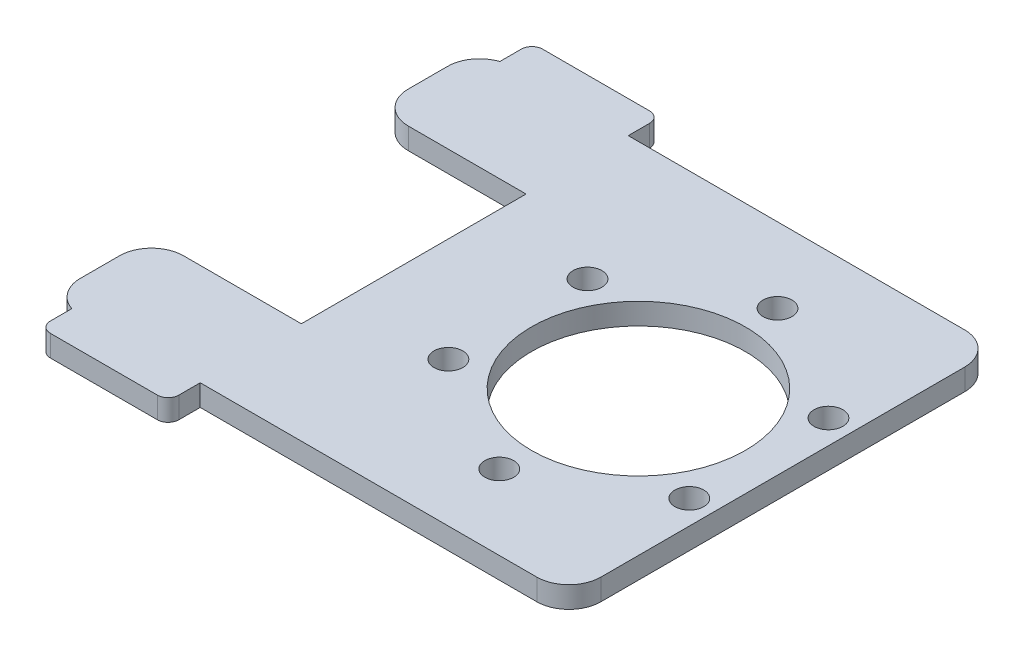
ISO-10303-21;
HEADER;
FILE_DESCRIPTION(('STEP AP214'),'2;1');
FILE_NAME('part.step','',(''),(''),'','','');
FILE_SCHEMA(('AUTOMOTIVE_DESIGN { 1 0 10303 214 1 1 1 1 }'));
ENDSEC;
DATA;
#1=APPLICATION_CONTEXT('core data for automotive mechanical design processes');
#2=APPLICATION_PROTOCOL_DEFINITION('international standard','automotive_design',2000,#1);
#3=PRODUCT_CONTEXT('',#1,'mechanical');
#4=PRODUCT('Part','Part','',(#3));
#5=PRODUCT_RELATED_PRODUCT_CATEGORY('part','',(#4));
#6=PRODUCT_DEFINITION_FORMATION('','',#4);
#7=PRODUCT_DEFINITION_CONTEXT('part definition',#1,'design');
#8=PRODUCT_DEFINITION('design','',#6,#7);
#9=PRODUCT_DEFINITION_SHAPE('','',#8);
#10=(LENGTH_UNIT() NAMED_UNIT(*) SI_UNIT(.MILLI.,.METRE.));
#11=(NAMED_UNIT(*) PLANE_ANGLE_UNIT() SI_UNIT($,.RADIAN.));
#12=(NAMED_UNIT(*) SI_UNIT($,.STERADIAN.) SOLID_ANGLE_UNIT());
#13=UNCERTAINTY_MEASURE_WITH_UNIT(LENGTH_MEASURE(1.E-05),#10,'distance_accuracy_value','');
#14=(GEOMETRIC_REPRESENTATION_CONTEXT(3) GLOBAL_UNCERTAINTY_ASSIGNED_CONTEXT((#13)) GLOBAL_UNIT_ASSIGNED_CONTEXT((#10,
#11,#12)) REPRESENTATION_CONTEXT('',''));
#15=CARTESIAN_POINT('',(0.,0.,0.));
#16=DIRECTION('',(0.,0.,1.));
#17=DIRECTION('',(1.,0.,0.));
#18=AXIS2_PLACEMENT_3D('',#15,#16,#17);
#19=CARTESIAN_POINT('',(0.,2.,-10.5));
#20=DIRECTION('',(0.,0.,-1.));
#21=DIRECTION('',(-1.,0.,0.));
#22=AXIS2_PLACEMENT_3D('',#19,#20,#21);
#23=PLANE('',#22);
#24=DIRECTION('',(1.,0.,0.));
#25=VECTOR('',#24,1.);
#26=CARTESIAN_POINT('',(0.,2.,-10.5));
#27=LINE('',#26,#25);
#28=CARTESIAN_POINT('',(-21.25,2.,-10.5));
#29=VERTEX_POINT('',#28);
#30=CARTESIAN_POINT('',(-10.25,2.,-10.5));
#31=VERTEX_POINT('',#30);
#32=EDGE_CURVE('E203',#29,#31,#27,.T.);
#33=ORIENTED_EDGE('',*,*,#32,.F.);
#34=DIRECTION('',(0.,-1.,0.));
#35=VECTOR('',#34,1.);
#36=CARTESIAN_POINT('',(-21.25,0.,-10.5));
#37=LINE('',#36,#35);
#38=CARTESIAN_POINT('',(-21.25,0.,-10.5));
#39=VERTEX_POINT('',#38);
#40=EDGE_CURVE('E265',#29,#39,#37,.T.);
#41=ORIENTED_EDGE('',*,*,#40,.T.);
#42=DIRECTION('',(1.,0.,0.));
#43=VECTOR('',#42,1.);
#44=CARTESIAN_POINT('',(0.,0.,-10.5));
#45=LINE('',#44,#43);
#46=CARTESIAN_POINT('',(-10.25,0.,-10.5));
#47=VERTEX_POINT('',#46);
#48=EDGE_CURVE('E230',#39,#47,#45,.T.);
#49=ORIENTED_EDGE('',*,*,#48,.T.);
#50=DIRECTION('',(0.,-1.,0.));
#51=VECTOR('',#50,1.);
#52=CARTESIAN_POINT('',(-10.25,2.,-10.5));
#53=LINE('',#52,#51);
#54=EDGE_CURVE('E224',#31,#47,#53,.T.);
#55=ORIENTED_EDGE('',*,*,#54,.F.);
#56=EDGE_LOOP('',(#33,#41,#49,#55));
#57=FACE_BOUND('',#56,.T.);
#58=ADVANCED_FACE('F39',(#57),#23,.F.);
#59=CARTESIAN_POINT('',(-10.25,2.,0.));
#60=DIRECTION('',(1.,0.,0.));
#61=DIRECTION('',(0.,0.,-1.));
#62=AXIS2_PLACEMENT_3D('',#59,#60,#61);
#63=PLANE('',#62);
#64=DIRECTION('',(0.,0.,1.));
#65=VECTOR('',#64,1.);
#66=CARTESIAN_POINT('',(-10.25,0.,0.));
#67=LINE('',#66,#65);
#68=CARTESIAN_POINT('',(-10.25,0.,10.5));
#69=VERTEX_POINT('',#68);
#70=EDGE_CURVE('E504',#47,#69,#67,.T.);
#71=ORIENTED_EDGE('',*,*,#70,.T.);
#72=DIRECTION('',(0.,-1.,0.));
#73=VECTOR('',#72,1.);
#74=CARTESIAN_POINT('',(-10.25,2.,10.5));
#75=LINE('',#74,#73);
#76=CARTESIAN_POINT('',(-10.25,2.,10.5));
#77=VERTEX_POINT('',#76);
#78=EDGE_CURVE('E226',#77,#69,#75,.T.);
#79=ORIENTED_EDGE('',*,*,#78,.F.);
#80=DIRECTION('',(0.,0.,1.));
#81=VECTOR('',#80,1.);
#82=CARTESIAN_POINT('',(-10.25,2.,0.));
#83=LINE('',#82,#81);
#84=EDGE_CURVE('E209',#31,#77,#83,.T.);
#85=ORIENTED_EDGE('',*,*,#84,.F.);
#86=ORIENTED_EDGE('',*,*,#54,.T.);
#87=EDGE_LOOP('',(#71,#79,#85,#86));
#88=FACE_BOUND('',#87,.T.);
#89=ADVANCED_FACE('F223',(#88),#63,.F.);
#90=CARTESIAN_POINT('',(0.,2.,10.5));
#91=DIRECTION('',(0.,0.,-1.));
#92=DIRECTION('',(-1.,0.,0.));
#93=AXIS2_PLACEMENT_3D('',#90,#91,#92);
#94=PLANE('',#93);
#95=DIRECTION('',(1.,0.,0.));
#96=VECTOR('',#95,1.);
#97=CARTESIAN_POINT('',(0.,0.,10.5));
#98=LINE('',#97,#96);
#99=CARTESIAN_POINT('',(-21.25,0.,10.5));
#100=VERTEX_POINT('',#99);
#101=EDGE_CURVE('E385',#100,#69,#98,.T.);
#102=ORIENTED_EDGE('',*,*,#101,.F.);
#103=DIRECTION('',(0.,-1.,0.));
#104=VECTOR('',#103,1.);
#105=CARTESIAN_POINT('',(-21.25,2.,10.5));
#106=LINE('',#105,#104);
#107=CARTESIAN_POINT('',(-21.25,2.,10.5));
#108=VERTEX_POINT('',#107);
#109=EDGE_CURVE('E272',#100,#108,#106,.F.);
#110=ORIENTED_EDGE('',*,*,#109,.T.);
#111=DIRECTION('',(1.,0.,0.));
#112=VECTOR('',#111,1.);
#113=CARTESIAN_POINT('',(0.,2.,10.5));
#114=LINE('',#113,#112);
#115=EDGE_CURVE('E227',#108,#77,#114,.T.);
#116=ORIENTED_EDGE('',*,*,#115,.T.);
#117=ORIENTED_EDGE('',*,*,#78,.T.);
#118=EDGE_LOOP('',(#102,#110,#116,#117));
#119=FACE_BOUND('',#118,.T.);
#120=ADVANCED_FACE('F409',(#119),#94,.T.);
#121=CARTESIAN_POINT('',(-24.25,2.,0.));
#122=DIRECTION('',(-1.,0.,0.));
#123=DIRECTION('',(0.,0.,1.));
#124=AXIS2_PLACEMENT_3D('',#121,#122,#123);
#125=PLANE('',#124);
#126=DIRECTION('',(0.,0.,-1.));
#127=VECTOR('',#126,1.);
#128=CARTESIAN_POINT('',(-24.25,0.,0.));
#129=LINE('',#128,#127);
#130=CARTESIAN_POINT('',(-24.25,0.,17.1543893449736));
#131=VERTEX_POINT('',#130);
#132=CARTESIAN_POINT('',(-24.25,0.,13.5));
#133=VERTEX_POINT('',#132);
#134=EDGE_CURVE('E348',#131,#133,#129,.T.);
#135=ORIENTED_EDGE('',*,*,#134,.F.);
#136=DIRECTION('',(0.,1.,0.));
#137=VECTOR('',#136,1.);
#138=CARTESIAN_POINT('',(-24.25,2.,17.1543893449736));
#139=LINE('',#138,#137);
#140=CARTESIAN_POINT('',(-24.25,2.,17.1543893449736));
#141=VERTEX_POINT('',#140);
#142=EDGE_CURVE('E270',#131,#141,#139,.T.);
#143=ORIENTED_EDGE('',*,*,#142,.T.);
#144=DIRECTION('',(0.,0.,-1.));
#145=VECTOR('',#144,1.);
#146=CARTESIAN_POINT('',(-24.25,2.,0.));
#147=LINE('',#146,#145);
#148=CARTESIAN_POINT('',(-24.25,2.,13.5));
#149=VERTEX_POINT('',#148);
#150=EDGE_CURVE('E329',#141,#149,#147,.T.);
#151=ORIENTED_EDGE('',*,*,#150,.T.);
#152=DIRECTION('',(0.,-1.,0.));
#153=VECTOR('',#152,1.);
#154=CARTESIAN_POINT('',(-24.25,2.,13.5));
#155=LINE('',#154,#153);
#156=EDGE_CURVE('E267',#149,#133,#155,.T.);
#157=ORIENTED_EDGE('',*,*,#156,.T.);
#158=EDGE_LOOP('',(#135,#143,#151,#157));
#159=FACE_BOUND('',#158,.T.);
#160=ADVANCED_FACE('F382',(#159),#125,.T.);
#161=CARTESIAN_POINT('',(-22.2,2.,0.));
#162=DIRECTION('',(1.,0.,0.));
#163=DIRECTION('',(0.,0.,-1.));
#164=AXIS2_PLACEMENT_3D('',#161,#162,#163);
#165=PLANE('',#164);
#166=DIRECTION('',(0.,0.,1.));
#167=VECTOR('',#166,1.);
#168=CARTESIAN_POINT('',(-22.2,0.,0.));
#169=LINE('',#168,#167);
#170=CARTESIAN_POINT('',(-22.2,0.,20.));
#171=VERTEX_POINT('',#170);
#172=CARTESIAN_POINT('',(-22.2,0.,22.));
#173=VERTEX_POINT('',#172);
#174=EDGE_CURVE('E322',#171,#173,#169,.T.);
#175=ORIENTED_EDGE('',*,*,#174,.T.);
#176=DIRECTION('',(0.,-1.,0.));
#177=VECTOR('',#176,1.);
#178=CARTESIAN_POINT('',(-22.2,2.,22.));
#179=LINE('',#178,#177);
#180=CARTESIAN_POINT('',(-22.2,2.,22.));
#181=VERTEX_POINT('',#180);
#182=EDGE_CURVE('E47',#173,#181,#179,.F.);
#183=ORIENTED_EDGE('',*,*,#182,.T.);
#184=DIRECTION('',(0.,0.,1.));
#185=VECTOR('',#184,1.);
#186=CARTESIAN_POINT('',(-22.2,2.,0.));
#187=LINE('',#186,#185);
#188=CARTESIAN_POINT('',(-22.2,2.,20.));
#189=VERTEX_POINT('',#188);
#190=EDGE_CURVE('E319',#189,#181,#187,.T.);
#191=ORIENTED_EDGE('',*,*,#190,.F.);
#192=DIRECTION('',(0.,-1.,0.));
#193=VECTOR('',#192,1.);
#194=CARTESIAN_POINT('',(-22.2,2.,20.));
#195=LINE('',#194,#193);
#196=EDGE_CURVE('E236',#189,#171,#195,.T.);
#197=ORIENTED_EDGE('',*,*,#196,.T.);
#198=EDGE_LOOP('',(#175,#183,#191,#197));
#199=FACE_BOUND('',#198,.T.);
#200=ADVANCED_FACE('F317',(#199),#165,.F.);
#201=CARTESIAN_POINT('',(0.,2.,23.));
#202=DIRECTION('',(0.,0.,-1.));
#203=DIRECTION('',(-1.,0.,0.));
#204=AXIS2_PLACEMENT_3D('',#201,#202,#203);
#205=PLANE('',#204);
#206=DIRECTION('',(1.,0.,0.));
#207=VECTOR('',#206,1.);
#208=CARTESIAN_POINT('',(0.,2.,23.));
#209=LINE('',#208,#207);
#210=CARTESIAN_POINT('',(-21.2,2.,23.));
#211=VERTEX_POINT('',#210);
#212=CARTESIAN_POINT('',(-11.2,2.,23.));
#213=VERTEX_POINT('',#212);
#214=EDGE_CURVE('E328',#211,#213,#209,.T.);
#215=ORIENTED_EDGE('',*,*,#214,.F.);
#216=DIRECTION('',(0.,-1.,0.));
#217=VECTOR('',#216,1.);
#218=CARTESIAN_POINT('',(-21.2,2.,23.));
#219=LINE('',#218,#217);
#220=CARTESIAN_POINT('',(-21.2,0.,23.));
#221=VERTEX_POINT('',#220);
#222=EDGE_CURVE('E310',#211,#221,#219,.T.);
#223=ORIENTED_EDGE('',*,*,#222,.T.);
#224=DIRECTION('',(1.,0.,0.));
#225=VECTOR('',#224,1.);
#226=CARTESIAN_POINT('',(0.,0.,23.));
#227=LINE('',#226,#225);
#228=CARTESIAN_POINT('',(-11.2,0.,23.));
#229=VERTEX_POINT('',#228);
#230=EDGE_CURVE('E337',#221,#229,#227,.T.);
#231=ORIENTED_EDGE('',*,*,#230,.T.);
#232=DIRECTION('',(0.,-1.,0.));
#233=VECTOR('',#232,1.);
#234=CARTESIAN_POINT('',(-11.2,2.,23.));
#235=LINE('',#234,#233);
#236=EDGE_CURVE('E308',#229,#213,#235,.F.);
#237=ORIENTED_EDGE('',*,*,#236,.T.);
#238=EDGE_LOOP('',(#215,#223,#231,#237));
#239=FACE_BOUND('',#238,.T.);
#240=ADVANCED_FACE('F336',(#239),#205,.F.);
#241=CARTESIAN_POINT('',(-10.2,2.,0.));
#242=DIRECTION('',(1.,0.,0.));
#243=DIRECTION('',(0.,0.,-1.));
#244=AXIS2_PLACEMENT_3D('',#241,#242,#243);
#245=PLANE('',#244);
#246=DIRECTION('',(0.,0.,1.));
#247=VECTOR('',#246,1.);
#248=CARTESIAN_POINT('',(-10.2,2.,0.));
#249=LINE('',#248,#247);
#250=CARTESIAN_POINT('',(-10.2,2.,20.));
#251=VERTEX_POINT('',#250);
#252=CARTESIAN_POINT('',(-10.2,2.,22.));
#253=VERTEX_POINT('',#252);
#254=EDGE_CURVE('E537',#251,#253,#249,.T.);
#255=ORIENTED_EDGE('',*,*,#254,.T.);
#256=DIRECTION('',(0.,-1.,0.));
#257=VECTOR('',#256,1.);
#258=CARTESIAN_POINT('',(-10.2,0.,22.));
#259=LINE('',#258,#257);
#260=CARTESIAN_POINT('',(-10.2,0.,22.));
#261=VERTEX_POINT('',#260);
#262=EDGE_CURVE('E11',#253,#261,#259,.T.);
#263=ORIENTED_EDGE('',*,*,#262,.T.);
#264=DIRECTION('',(0.,0.,1.));
#265=VECTOR('',#264,1.);
#266=CARTESIAN_POINT('',(-10.2,0.,0.));
#267=LINE('',#266,#265);
#268=CARTESIAN_POINT('',(-10.2,0.,20.));
#269=VERTEX_POINT('',#268);
#270=EDGE_CURVE('E344',#269,#261,#267,.T.);
#271=ORIENTED_EDGE('',*,*,#270,.F.);
#272=DIRECTION('',(0.,-1.,0.));
#273=VECTOR('',#272,1.);
#274=CARTESIAN_POINT('',(-10.2,2.,20.));
#275=LINE('',#274,#273);
#276=EDGE_CURVE('E376',#251,#269,#275,.T.);
#277=ORIENTED_EDGE('',*,*,#276,.F.);
#278=EDGE_LOOP('',(#255,#263,#271,#277));
#279=FACE_BOUND('',#278,.T.);
#280=ADVANCED_FACE('F605',(#279),#245,.T.);
#281=CARTESIAN_POINT('',(0.,2.,20.));
#282=DIRECTION('',(0.,0.,-1.));
#283=DIRECTION('',(-1.,0.,0.));
#284=AXIS2_PLACEMENT_3D('',#281,#282,#283);
#285=PLANE('',#284);
#286=DIRECTION('',(1.,0.,0.));
#287=VECTOR('',#286,1.);
#288=CARTESIAN_POINT('',(0.,0.,20.));
#289=LINE('',#288,#287);
#290=CARTESIAN_POINT('',(21.25,0.,20.));
#291=VERTEX_POINT('',#290);
#292=EDGE_CURVE('E346',#269,#291,#289,.T.);
#293=ORIENTED_EDGE('',*,*,#292,.T.);
#294=DIRECTION('',(0.,-1.,0.));
#295=VECTOR('',#294,1.);
#296=CARTESIAN_POINT('',(21.25,2.,20.));
#297=LINE('',#296,#295);
#298=CARTESIAN_POINT('',(21.25,2.,20.));
#299=VERTEX_POINT('',#298);
#300=EDGE_CURVE('E279',#291,#299,#297,.F.);
#301=ORIENTED_EDGE('',*,*,#300,.T.);
#302=DIRECTION('',(1.,0.,0.));
#303=VECTOR('',#302,1.);
#304=CARTESIAN_POINT('',(0.,2.,20.));
#305=LINE('',#304,#303);
#306=EDGE_CURVE('E527',#251,#299,#305,.T.);
#307=ORIENTED_EDGE('',*,*,#306,.F.);
#308=ORIENTED_EDGE('',*,*,#276,.T.);
#309=EDGE_LOOP('',(#293,#301,#307,#308));
#310=FACE_BOUND('',#309,.T.);
#311=ADVANCED_FACE('F516',(#310),#285,.F.);
#312=CARTESIAN_POINT('',(24.25,2.,0.));
#313=DIRECTION('',(-1.,0.,0.));
#314=DIRECTION('',(0.,0.,1.));
#315=AXIS2_PLACEMENT_3D('',#312,#313,#314);
#316=PLANE('',#315);
#317=DIRECTION('',(0.,0.,-1.));
#318=VECTOR('',#317,1.);
#319=CARTESIAN_POINT('',(24.25,2.,0.));
#320=LINE('',#319,#318);
#321=CARTESIAN_POINT('',(24.25,2.,17.));
#322=VERTEX_POINT('',#321);
#323=CARTESIAN_POINT('',(24.25,2.,-17.));
#324=VERTEX_POINT('',#323);
#325=EDGE_CURVE('E525',#322,#324,#320,.T.);
#326=ORIENTED_EDGE('',*,*,#325,.F.);
#327=DIRECTION('',(0.,-1.,0.));
#328=VECTOR('',#327,1.);
#329=CARTESIAN_POINT('',(24.25,2.,17.));
#330=LINE('',#329,#328);
#331=CARTESIAN_POINT('',(24.25,0.,17.));
#332=VERTEX_POINT('',#331);
#333=EDGE_CURVE('E276',#322,#332,#330,.T.);
#334=ORIENTED_EDGE('',*,*,#333,.T.);
#335=DIRECTION('',(0.,0.,-1.));
#336=VECTOR('',#335,1.);
#337=CARTESIAN_POINT('',(24.25,0.,0.));
#338=LINE('',#337,#336);
#339=CARTESIAN_POINT('',(24.25,0.,-17.));
#340=VERTEX_POINT('',#339);
#341=EDGE_CURVE('E352',#332,#340,#338,.T.);
#342=ORIENTED_EDGE('',*,*,#341,.T.);
#343=DIRECTION('',(0.,-1.,0.));
#344=VECTOR('',#343,1.);
#345=CARTESIAN_POINT('',(24.25,2.,-17.));
#346=LINE('',#345,#344);
#347=EDGE_CURVE('E274',#340,#324,#346,.F.);
#348=ORIENTED_EDGE('',*,*,#347,.T.);
#349=EDGE_LOOP('',(#326,#334,#342,#348));
#350=FACE_BOUND('',#349,.T.);
#351=ADVANCED_FACE('F529',(#350),#316,.F.);
#352=CARTESIAN_POINT('',(0.,2.,-20.));
#353=DIRECTION('',(0.,0.,-1.));
#354=DIRECTION('',(-1.,0.,0.));
#355=AXIS2_PLACEMENT_3D('',#352,#353,#354);
#356=PLANE('',#355);
#357=DIRECTION('',(1.,0.,0.));
#358=VECTOR('',#357,1.);
#359=CARTESIAN_POINT('',(0.,2.,-20.));
#360=LINE('',#359,#358);
#361=CARTESIAN_POINT('',(-10.2,2.,-20.));
#362=VERTEX_POINT('',#361);
#363=CARTESIAN_POINT('',(21.25,2.,-20.));
#364=VERTEX_POINT('',#363);
#365=EDGE_CURVE('E532',#362,#364,#360,.T.);
#366=ORIENTED_EDGE('',*,*,#365,.T.);
#367=DIRECTION('',(0.,-1.,0.));
#368=VECTOR('',#367,1.);
#369=CARTESIAN_POINT('',(21.25,0.,-20.));
#370=LINE('',#369,#368);
#371=CARTESIAN_POINT('',(21.25,0.,-20.));
#372=VERTEX_POINT('',#371);
#373=EDGE_CURVE('E281',#364,#372,#370,.T.);
#374=ORIENTED_EDGE('',*,*,#373,.T.);
#375=DIRECTION('',(1.,0.,0.));
#376=VECTOR('',#375,1.);
#377=CARTESIAN_POINT('',(0.,0.,-20.));
#378=LINE('',#377,#376);
#379=CARTESIAN_POINT('',(-10.2,0.,-20.));
#380=VERTEX_POINT('',#379);
#381=EDGE_CURVE('E355',#380,#372,#378,.T.);
#382=ORIENTED_EDGE('',*,*,#381,.F.);
#383=DIRECTION('',(0.,-1.,0.));
#384=VECTOR('',#383,1.);
#385=CARTESIAN_POINT('',(-10.2,2.,-20.));
#386=LINE('',#385,#384);
#387=EDGE_CURVE('E373',#362,#380,#386,.T.);
#388=ORIENTED_EDGE('',*,*,#387,.F.);
#389=EDGE_LOOP('',(#366,#374,#382,#388));
#390=FACE_BOUND('',#389,.T.);
#391=ADVANCED_FACE('F580',(#390),#356,.T.);
#392=CARTESIAN_POINT('',(-10.2,2.,0.));
#393=DIRECTION('',(-1.,0.,0.));
#394=DIRECTION('',(0.,0.,1.));
#395=AXIS2_PLACEMENT_3D('',#392,#393,#394);
#396=PLANE('',#395);
#397=DIRECTION('',(0.,0.,-1.));
#398=VECTOR('',#397,1.);
#399=CARTESIAN_POINT('',(-10.2,0.,0.));
#400=LINE('',#399,#398);
#401=CARTESIAN_POINT('',(-10.2,0.,-22.));
#402=VERTEX_POINT('',#401);
#403=EDGE_CURVE('E358',#380,#402,#400,.T.);
#404=ORIENTED_EDGE('',*,*,#403,.T.);
#405=DIRECTION('',(0.,-1.,0.));
#406=VECTOR('',#405,1.);
#407=CARTESIAN_POINT('',(-10.2,2.,-22.));
#408=LINE('',#407,#406);
#409=CARTESIAN_POINT('',(-10.2,2.,-22.));
#410=VERTEX_POINT('',#409);
#411=EDGE_CURVE('E54',#402,#410,#408,.F.);
#412=ORIENTED_EDGE('',*,*,#411,.T.);
#413=DIRECTION('',(0.,0.,-1.));
#414=VECTOR('',#413,1.);
#415=CARTESIAN_POINT('',(-10.2,2.,0.));
#416=LINE('',#415,#414);
#417=EDGE_CURVE('E535',#362,#410,#416,.T.);
#418=ORIENTED_EDGE('',*,*,#417,.F.);
#419=ORIENTED_EDGE('',*,*,#387,.T.);
#420=EDGE_LOOP('',(#404,#412,#418,#419));
#421=FACE_BOUND('',#420,.T.);
#422=ADVANCED_FACE('F577',(#421),#396,.F.);
#423=CARTESIAN_POINT('',(0.,2.,-23.));
#424=DIRECTION('',(0.,0.,-1.));
#425=DIRECTION('',(-1.,0.,0.));
#426=AXIS2_PLACEMENT_3D('',#423,#424,#425);
#427=PLANE('',#426);
#428=DIRECTION('',(1.,0.,0.));
#429=VECTOR('',#428,1.);
#430=CARTESIAN_POINT('',(0.,0.,-23.));
#431=LINE('',#430,#429);
#432=CARTESIAN_POINT('',(-21.2,0.,-23.));
#433=VERTEX_POINT('',#432);
#434=CARTESIAN_POINT('',(-11.2,0.,-23.));
#435=VERTEX_POINT('',#434);
#436=EDGE_CURVE('E360',#433,#435,#431,.T.);
#437=ORIENTED_EDGE('',*,*,#436,.F.);
#438=DIRECTION('',(0.,-1.,0.));
#439=VECTOR('',#438,1.);
#440=CARTESIAN_POINT('',(-21.2,2.,-23.));
#441=LINE('',#440,#439);
#442=CARTESIAN_POINT('',(-21.2,2.,-23.));
#443=VERTEX_POINT('',#442);
#444=EDGE_CURVE('E298',#433,#443,#441,.F.);
#445=ORIENTED_EDGE('',*,*,#444,.T.);
#446=DIRECTION('',(1.,0.,0.));
#447=VECTOR('',#446,1.);
#448=CARTESIAN_POINT('',(0.,2.,-23.));
#449=LINE('',#448,#447);
#450=CARTESIAN_POINT('',(-11.2,2.,-23.));
#451=VERTEX_POINT('',#450);
#452=EDGE_CURVE('E461',#443,#451,#449,.T.);
#453=ORIENTED_EDGE('',*,*,#452,.T.);
#454=DIRECTION('',(0.,-1.,0.));
#455=VECTOR('',#454,1.);
#456=CARTESIAN_POINT('',(-11.2,0.,-23.));
#457=LINE('',#456,#455);
#458=EDGE_CURVE('E295',#451,#435,#457,.T.);
#459=ORIENTED_EDGE('',*,*,#458,.T.);
#460=EDGE_LOOP('',(#437,#445,#453,#459));
#461=FACE_BOUND('',#460,.T.);
#462=ADVANCED_FACE('F569',(#461),#427,.T.);
#463=CARTESIAN_POINT('',(-22.2,2.,0.));
#464=DIRECTION('',(-1.,0.,0.));
#465=DIRECTION('',(0.,0.,1.));
#466=AXIS2_PLACEMENT_3D('',#463,#464,#465);
#467=PLANE('',#466);
#468=DIRECTION('',(0.,0.,-1.));
#469=VECTOR('',#468,1.);
#470=CARTESIAN_POINT('',(-22.2,2.,0.));
#471=LINE('',#470,#469);
#472=CARTESIAN_POINT('',(-22.2,2.,-20.));
#473=VERTEX_POINT('',#472);
#474=CARTESIAN_POINT('',(-22.2,2.,-22.));
#475=VERTEX_POINT('',#474);
#476=EDGE_CURVE('E453',#473,#475,#471,.T.);
#477=ORIENTED_EDGE('',*,*,#476,.T.);
#478=DIRECTION('',(0.,-1.,0.));
#479=VECTOR('',#478,1.);
#480=CARTESIAN_POINT('',(-22.2,2.,-22.));
#481=LINE('',#480,#479);
#482=CARTESIAN_POINT('',(-22.2,0.,-22.));
#483=VERTEX_POINT('',#482);
#484=EDGE_CURVE('E284',#475,#483,#481,.T.);
#485=ORIENTED_EDGE('',*,*,#484,.T.);
#486=DIRECTION('',(0.,0.,-1.));
#487=VECTOR('',#486,1.);
#488=CARTESIAN_POINT('',(-22.2,0.,0.));
#489=LINE('',#488,#487);
#490=CARTESIAN_POINT('',(-22.2,0.,-20.));
#491=VERTEX_POINT('',#490);
#492=EDGE_CURVE('E363',#491,#483,#489,.T.);
#493=ORIENTED_EDGE('',*,*,#492,.F.);
#494=DIRECTION('',(0.,-1.,0.));
#495=VECTOR('',#494,1.);
#496=CARTESIAN_POINT('',(-22.2,2.,-20.));
#497=LINE('',#496,#495);
#498=EDGE_CURVE('E370',#473,#491,#497,.T.);
#499=ORIENTED_EDGE('',*,*,#498,.F.);
#500=EDGE_LOOP('',(#477,#485,#493,#499));
#501=FACE_BOUND('',#500,.T.);
#502=ADVANCED_FACE('F627',(#501),#467,.T.);
#503=CARTESIAN_POINT('',(-24.25,2.,-13.5));
#504=VERTEX_POINT('',#503);
#505=CARTESIAN_POINT('',(-24.25,2.,-17.1543893449736));
#506=VERTEX_POINT('',#505);
#507=EDGE_CURVE('E451',#504,#506,#147,.T.);
#508=ORIENTED_EDGE('',*,*,#507,.T.);
#509=DIRECTION('',(0.,-1.,0.));
#510=VECTOR('',#509,1.);
#511=CARTESIAN_POINT('',(-24.25,0.,-17.1543893449736));
#512=LINE('',#511,#510);
#513=CARTESIAN_POINT('',(-24.25,0.,-17.1543893449736));
#514=VERTEX_POINT('',#513);
#515=EDGE_CURVE('E234',#506,#514,#512,.T.);
#516=ORIENTED_EDGE('',*,*,#515,.T.);
#517=CARTESIAN_POINT('',(-24.25,0.,-13.5));
#518=VERTEX_POINT('',#517);
#519=EDGE_CURVE('E365',#518,#514,#129,.T.);
#520=ORIENTED_EDGE('',*,*,#519,.F.);
#521=DIRECTION('',(0.,-1.,0.));
#522=VECTOR('',#521,1.);
#523=CARTESIAN_POINT('',(-24.25,2.,-13.5));
#524=LINE('',#523,#522);
#525=EDGE_CURVE('E232',#518,#504,#524,.F.);
#526=ORIENTED_EDGE('',*,*,#525,.T.);
#527=EDGE_LOOP('',(#508,#516,#520,#526));
#528=FACE_BOUND('',#527,.T.);
#529=ADVANCED_FACE('F417',(#528),#125,.T.);
#530=CARTESIAN_POINT('',(22.0083302491976,2.,-6.50000000000013));
#531=DIRECTION('',(0.,-1.,0.));
#532=DIRECTION('',(0.,0.,-1.));
#533=AXIS2_PLACEMENT_3D('',#530,#531,#532);
#534=CYLINDRICAL_SURFACE('',#533,1.35);
#535=CARTESIAN_POINT('',(22.0083302491976,2.,-6.50000000000013));
#536=DIRECTION('',(0.,1.,0.));
#537=DIRECTION('',(0.,0.,1.));
#538=AXIS2_PLACEMENT_3D('',#535,#536,#537);
#539=CIRCLE('',#538,1.35);
#540=CARTESIAN_POINT('',(22.0083302491976,2.,-5.15000000000013));
#541=VERTEX_POINT('',#540);
#542=EDGE_CURVE('E218',#541,#541,#539,.T.);
#543=ORIENTED_EDGE('',*,*,#542,.T.);
#544=EDGE_LOOP('',(#543));
#545=FACE_BOUND('',#544,.T.);
#546=CARTESIAN_POINT('',(22.0083302491976,0.,-6.50000000000013));
#547=DIRECTION('',(0.,1.,0.));
#548=DIRECTION('',(0.,0.,1.));
#549=AXIS2_PLACEMENT_3D('',#546,#547,#548);
#550=CIRCLE('',#549,1.35);
#551=CARTESIAN_POINT('',(22.0083302491976,0.,-5.15000000000013));
#552=VERTEX_POINT('',#551);
#553=EDGE_CURVE('E500',#552,#552,#550,.T.);
#554=ORIENTED_EDGE('',*,*,#553,.F.);
#555=EDGE_LOOP('',(#554));
#556=FACE_BOUND('',#555,.T.);
#557=ADVANCED_FACE('F413',(#545,#556),#534,.F.);
#558=CARTESIAN_POINT('',(10.75,2.,-13.));
#559=DIRECTION('',(0.,-1.,0.));
#560=DIRECTION('',(0.,0.,-1.));
#561=AXIS2_PLACEMENT_3D('',#558,#559,#560);
#562=CYLINDRICAL_SURFACE('',#561,1.35);
#563=CARTESIAN_POINT('',(10.75,2.,-13.));
#564=DIRECTION('',(0.,1.,0.));
#565=DIRECTION('',(0.,0.,1.));
#566=AXIS2_PLACEMENT_3D('',#563,#564,#565);
#567=CIRCLE('',#566,1.35);
#568=CARTESIAN_POINT('',(10.75,2.,-11.65));
#569=VERTEX_POINT('',#568);
#570=EDGE_CURVE('E469',#569,#569,#567,.T.);
#571=ORIENTED_EDGE('',*,*,#570,.T.);
#572=EDGE_LOOP('',(#571));
#573=FACE_BOUND('',#572,.T.);
#574=CARTESIAN_POINT('',(10.75,0.,-13.));
#575=DIRECTION('',(0.,1.,0.));
#576=DIRECTION('',(0.,0.,1.));
#577=AXIS2_PLACEMENT_3D('',#574,#575,#576);
#578=CIRCLE('',#577,1.35);
#579=CARTESIAN_POINT('',(10.75,0.,-11.65));
#580=VERTEX_POINT('',#579);
#581=EDGE_CURVE('E502',#580,#580,#578,.T.);
#582=ORIENTED_EDGE('',*,*,#581,.F.);
#583=EDGE_LOOP('',(#582));
#584=FACE_BOUND('',#583,.T.);
#585=ADVANCED_FACE('F416',(#573,#584),#562,.F.);
#586=CARTESIAN_POINT('',(-0.508330249197712,2.,-6.49999999999997));
#587=DIRECTION('',(0.,-1.,0.));
#588=DIRECTION('',(0.,0.,-1.));
#589=AXIS2_PLACEMENT_3D('',#586,#587,#588);
#590=CYLINDRICAL_SURFACE('',#589,1.35);
#591=CARTESIAN_POINT('',(-0.508330249197712,2.,-6.49999999999997));
#592=DIRECTION('',(0.,1.,0.));
#593=DIRECTION('',(0.,0.,1.));
#594=AXIS2_PLACEMENT_3D('',#591,#592,#593);
#595=CIRCLE('',#594,1.35);
#596=CARTESIAN_POINT('',(-0.508330249197712,2.,-5.14999999999997));
#597=VERTEX_POINT('',#596);
#598=EDGE_CURVE('E472',#597,#597,#595,.T.);
#599=ORIENTED_EDGE('',*,*,#598,.T.);
#600=EDGE_LOOP('',(#599));
#601=FACE_BOUND('',#600,.T.);
#602=CARTESIAN_POINT('',(-0.508330249197712,0.,-6.49999999999997));
#603=DIRECTION('',(0.,1.,0.));
#604=DIRECTION('',(0.,0.,1.));
#605=AXIS2_PLACEMENT_3D('',#602,#603,#604);
#606=CIRCLE('',#605,1.35);
#607=CARTESIAN_POINT('',(-0.508330249197712,0.,-5.14999999999997));
#608=VERTEX_POINT('',#607);
#609=EDGE_CURVE('E507',#608,#608,#606,.T.);
#610=ORIENTED_EDGE('',*,*,#609,.F.);
#611=EDGE_LOOP('',(#610));
#612=FACE_BOUND('',#611,.T.);
#613=ADVANCED_FACE('F421',(#601,#612),#590,.F.);
#614=CARTESIAN_POINT('',(-0.508330249197666,2.,6.50000000000005));
#615=DIRECTION('',(0.,-1.,0.));
#616=DIRECTION('',(0.,0.,-1.));
#617=AXIS2_PLACEMENT_3D('',#614,#615,#616);
#618=CYLINDRICAL_SURFACE('',#617,1.35);
#619=CARTESIAN_POINT('',(-0.508330249197666,2.,6.50000000000005));
#620=DIRECTION('',(0.,1.,0.));
#621=DIRECTION('',(0.,0.,1.));
#622=AXIS2_PLACEMENT_3D('',#619,#620,#621);
#623=CIRCLE('',#622,1.35);
#624=CARTESIAN_POINT('',(-0.508330249197666,2.,7.85000000000005));
#625=VERTEX_POINT('',#624);
#626=EDGE_CURVE('E475',#625,#625,#623,.T.);
#627=ORIENTED_EDGE('',*,*,#626,.T.);
#628=EDGE_LOOP('',(#627));
#629=FACE_BOUND('',#628,.T.);
#630=CARTESIAN_POINT('',(-0.508330249197666,0.,6.50000000000005));
#631=DIRECTION('',(0.,1.,0.));
#632=DIRECTION('',(0.,0.,1.));
#633=AXIS2_PLACEMENT_3D('',#630,#631,#632);
#634=CIRCLE('',#633,1.35);
#635=CARTESIAN_POINT('',(-0.508330249197666,0.,7.85000000000005));
#636=VERTEX_POINT('',#635);
#637=EDGE_CURVE('E550',#636,#636,#634,.T.);
#638=ORIENTED_EDGE('',*,*,#637,.F.);
#639=EDGE_LOOP('',(#638));
#640=FACE_BOUND('',#639,.T.);
#641=ADVANCED_FACE('F425',(#629,#640),#618,.F.);
#642=CARTESIAN_POINT('',(10.7500000000001,2.,13.));
#643=DIRECTION('',(0.,-1.,0.));
#644=DIRECTION('',(0.,0.,-1.));
#645=AXIS2_PLACEMENT_3D('',#642,#643,#644);
#646=CYLINDRICAL_SURFACE('',#645,1.35);
#647=CARTESIAN_POINT('',(10.7500000000001,2.,13.));
#648=DIRECTION('',(0.,1.,0.));
#649=DIRECTION('',(0.,0.,1.));
#650=AXIS2_PLACEMENT_3D('',#647,#648,#649);
#651=CIRCLE('',#650,1.35);
#652=CARTESIAN_POINT('',(10.7500000000001,2.,14.35));
#653=VERTEX_POINT('',#652);
#654=EDGE_CURVE('E478',#653,#653,#651,.T.);
#655=ORIENTED_EDGE('',*,*,#654,.T.);
#656=EDGE_LOOP('',(#655));
#657=FACE_BOUND('',#656,.T.);
#658=CARTESIAN_POINT('',(10.7500000000001,0.,13.));
#659=DIRECTION('',(0.,1.,0.));
#660=DIRECTION('',(0.,0.,1.));
#661=AXIS2_PLACEMENT_3D('',#658,#659,#660);
#662=CIRCLE('',#661,1.35);
#663=CARTESIAN_POINT('',(10.7500000000001,0.,14.35));
#664=VERTEX_POINT('',#663);
#665=EDGE_CURVE('E547',#664,#664,#662,.T.);
#666=ORIENTED_EDGE('',*,*,#665,.F.);
#667=EDGE_LOOP('',(#666));
#668=FACE_BOUND('',#667,.T.);
#669=ADVANCED_FACE('F429',(#657,#668),#646,.F.);
#670=CARTESIAN_POINT('',(22.0083302491978,2.,6.4999999999999));
#671=DIRECTION('',(0.,-1.,0.));
#672=DIRECTION('',(0.,0.,-1.));
#673=AXIS2_PLACEMENT_3D('',#670,#671,#672);
#674=CYLINDRICAL_SURFACE('',#673,1.35);
#675=CARTESIAN_POINT('',(22.0083302491978,2.,6.4999999999999));
#676=DIRECTION('',(0.,1.,0.));
#677=DIRECTION('',(0.,0.,1.));
#678=AXIS2_PLACEMENT_3D('',#675,#676,#677);
#679=CIRCLE('',#678,1.35);
#680=CARTESIAN_POINT('',(22.0083302491978,2.,7.8499999999999));
#681=VERTEX_POINT('',#680);
#682=EDGE_CURVE('E369',#681,#681,#679,.T.);
#683=ORIENTED_EDGE('',*,*,#682,.T.);
#684=EDGE_LOOP('',(#683));
#685=FACE_BOUND('',#684,.T.);
#686=CARTESIAN_POINT('',(22.0083302491978,0.,6.4999999999999));
#687=DIRECTION('',(0.,1.,0.));
#688=DIRECTION('',(0.,0.,1.));
#689=AXIS2_PLACEMENT_3D('',#686,#687,#688);
#690=CIRCLE('',#689,1.35);
#691=CARTESIAN_POINT('',(22.0083302491978,0.,7.8499999999999));
#692=VERTEX_POINT('',#691);
#693=EDGE_CURVE('E544',#692,#692,#690,.T.);
#694=ORIENTED_EDGE('',*,*,#693,.F.);
#695=EDGE_LOOP('',(#694));
#696=FACE_BOUND('',#695,.T.);
#697=ADVANCED_FACE('F433',(#685,#696),#674,.F.);
#698=CARTESIAN_POINT('',(10.75,2.,0.));
#699=DIRECTION('',(0.,-1.,0.));
#700=DIRECTION('',(0.,0.,-1.));
#701=AXIS2_PLACEMENT_3D('',#698,#699,#700);
#702=CYLINDRICAL_SURFACE('',#701,10.);
#703=CARTESIAN_POINT('',(10.75,2.,0.));
#704=DIRECTION('',(0.,1.,0.));
#705=DIRECTION('',(0.,0.,1.));
#706=AXIS2_PLACEMENT_3D('',#703,#704,#705);
#707=CIRCLE('',#706,10.);
#708=CARTESIAN_POINT('',(10.75,2.,10.));
#709=VERTEX_POINT('',#708);
#710=EDGE_CURVE('E374',#709,#709,#707,.T.);
#711=ORIENTED_EDGE('',*,*,#710,.T.);
#712=EDGE_LOOP('',(#711));
#713=FACE_BOUND('',#712,.T.);
#714=CARTESIAN_POINT('',(10.75,0.,0.));
#715=DIRECTION('',(0.,1.,0.));
#716=DIRECTION('',(0.,0.,1.));
#717=AXIS2_PLACEMENT_3D('',#714,#715,#716);
#718=CIRCLE('',#717,10.);
#719=CARTESIAN_POINT('',(10.75,0.,10.));
#720=VERTEX_POINT('',#719);
#721=EDGE_CURVE('E366',#720,#720,#718,.T.);
#722=ORIENTED_EDGE('',*,*,#721,.F.);
#723=EDGE_LOOP('',(#722));
#724=FACE_BOUND('',#723,.T.);
#725=ADVANCED_FACE('F437',(#713,#724),#702,.F.);
#726=CARTESIAN_POINT('',(0.,2.,0.));
#727=DIRECTION('',(0.,1.,0.));
#728=DIRECTION('',(0.,0.,1.));
#729=AXIS2_PLACEMENT_3D('',#726,#727,#728);
#730=PLANE('',#729);
#731=ORIENTED_EDGE('',*,*,#682,.F.);
#732=EDGE_LOOP('',(#731));
#733=FACE_BOUND('',#732,.T.);
#734=ORIENTED_EDGE('',*,*,#654,.F.);
#735=EDGE_LOOP('',(#734));
#736=FACE_BOUND('',#735,.T.);
#737=ORIENTED_EDGE('',*,*,#626,.F.);
#738=EDGE_LOOP('',(#737));
#739=FACE_BOUND('',#738,.T.);
#740=ORIENTED_EDGE('',*,*,#598,.F.);
#741=EDGE_LOOP('',(#740));
#742=FACE_BOUND('',#741,.T.);
#743=ORIENTED_EDGE('',*,*,#570,.F.);
#744=EDGE_LOOP('',(#743));
#745=FACE_BOUND('',#744,.T.);
#746=ORIENTED_EDGE('',*,*,#542,.F.);
#747=EDGE_LOOP('',(#746));
#748=FACE_BOUND('',#747,.T.);
#749=ORIENTED_EDGE('',*,*,#452,.F.);
#750=CARTESIAN_POINT('',(-21.2,2.,-22.));
#751=DIRECTION('',(0.,1.,0.));
#752=DIRECTION('',(0.,0.,1.));
#753=AXIS2_PLACEMENT_3D('',#750,#751,#752);
#754=CIRCLE('',#753,1.);
#755=EDGE_CURVE('E305',#443,#475,#754,.T.);
#756=ORIENTED_EDGE('',*,*,#755,.T.);
#757=ORIENTED_EDGE('',*,*,#476,.F.);
#758=CARTESIAN_POINT('',(-21.25,2.,-17.1543893449736));
#759=DIRECTION('',(0.,1.,0.));
#760=DIRECTION('',(0.,0.,1.));
#761=AXIS2_PLACEMENT_3D('',#758,#759,#760);
#762=CIRCLE('',#761,3.);
#763=EDGE_CURVE('E263',#473,#506,#762,.T.);
#764=ORIENTED_EDGE('',*,*,#763,.T.);
#765=ORIENTED_EDGE('',*,*,#507,.F.);
#766=CARTESIAN_POINT('',(-21.25,2.,-13.5));
#767=DIRECTION('',(0.,1.,0.));
#768=DIRECTION('',(0.,0.,1.));
#769=AXIS2_PLACEMENT_3D('',#766,#767,#768);
#770=CIRCLE('',#769,3.);
#771=EDGE_CURVE('E213',#504,#29,#770,.T.);
#772=ORIENTED_EDGE('',*,*,#771,.T.);
#773=ORIENTED_EDGE('',*,*,#32,.T.);
#774=ORIENTED_EDGE('',*,*,#84,.T.);
#775=ORIENTED_EDGE('',*,*,#115,.F.);
#776=CARTESIAN_POINT('',(-21.25,2.,13.5));
#777=DIRECTION('',(0.,1.,0.));
#778=DIRECTION('',(0.,0.,1.));
#779=AXIS2_PLACEMENT_3D('',#776,#777,#778);
#780=CIRCLE('',#779,3.);
#781=EDGE_CURVE('E258',#108,#149,#780,.T.);
#782=ORIENTED_EDGE('',*,*,#781,.T.);
#783=ORIENTED_EDGE('',*,*,#150,.F.);
#784=CARTESIAN_POINT('',(-21.25,2.,17.1543893449736));
#785=DIRECTION('',(0.,1.,0.));
#786=DIRECTION('',(0.,0.,1.));
#787=AXIS2_PLACEMENT_3D('',#784,#785,#786);
#788=CIRCLE('',#787,3.);
#789=EDGE_CURVE('E260',#141,#189,#788,.T.);
#790=ORIENTED_EDGE('',*,*,#789,.T.);
#791=ORIENTED_EDGE('',*,*,#190,.T.);
#792=CARTESIAN_POINT('',(-21.2,2.,22.));
#793=DIRECTION('',(0.,1.,0.));
#794=DIRECTION('',(0.,0.,1.));
#795=AXIS2_PLACEMENT_3D('',#792,#793,#794);
#796=CIRCLE('',#795,1.);
#797=EDGE_CURVE('E301',#181,#211,#796,.T.);
#798=ORIENTED_EDGE('',*,*,#797,.T.);
#799=ORIENTED_EDGE('',*,*,#214,.T.);
#800=CARTESIAN_POINT('',(-11.2,2.,22.));
#801=DIRECTION('',(0.,1.,0.));
#802=DIRECTION('',(0.,0.,1.));
#803=AXIS2_PLACEMENT_3D('',#800,#801,#802);
#804=CIRCLE('',#803,1.);
#805=EDGE_CURVE('E62',#213,#253,#804,.T.);
#806=ORIENTED_EDGE('',*,*,#805,.T.);
#807=ORIENTED_EDGE('',*,*,#254,.F.);
#808=ORIENTED_EDGE('',*,*,#306,.T.);
#809=CARTESIAN_POINT('',(21.25,2.,17.));
#810=DIRECTION('',(0.,1.,0.));
#811=DIRECTION('',(0.,0.,1.));
#812=AXIS2_PLACEMENT_3D('',#809,#810,#811);
#813=CIRCLE('',#812,3.);
#814=EDGE_CURVE('E256',#299,#322,#813,.T.);
#815=ORIENTED_EDGE('',*,*,#814,.T.);
#816=ORIENTED_EDGE('',*,*,#325,.T.);
#817=CARTESIAN_POINT('',(21.25,2.,-17.));
#818=DIRECTION('',(0.,1.,0.));
#819=DIRECTION('',(0.,0.,1.));
#820=AXIS2_PLACEMENT_3D('',#817,#818,#819);
#821=CIRCLE('',#820,3.);
#822=EDGE_CURVE('E254',#324,#364,#821,.T.);
#823=ORIENTED_EDGE('',*,*,#822,.T.);
#824=ORIENTED_EDGE('',*,*,#365,.F.);
#825=ORIENTED_EDGE('',*,*,#417,.T.);
#826=CARTESIAN_POINT('',(-11.2,2.,-22.));
#827=DIRECTION('',(0.,1.,0.));
#828=DIRECTION('',(0.,0.,1.));
#829=AXIS2_PLACEMENT_3D('',#826,#827,#828);
#830=CIRCLE('',#829,1.);
#831=EDGE_CURVE('E303',#410,#451,#830,.T.);
#832=ORIENTED_EDGE('',*,*,#831,.T.);
#833=EDGE_LOOP('',(#749,#756,#757,#764,#765,#772,#773,#774,#775,#782,#783,#790,#791,#798,#799,
#806,#807,#808,#815,#816,#823,#824,#825,#832));
#834=FACE_BOUND('',#833,.T.);
#835=ORIENTED_EDGE('',*,*,#710,.F.);
#836=EDGE_LOOP('',(#835));
#837=FACE_BOUND('',#836,.T.);
#838=ADVANCED_FACE('F206',(#733,#736,#739,#742,#745,#748,#834,#837),#730,.T.);
#839=CARTESIAN_POINT('',(0.,0.,0.));
#840=DIRECTION('',(0.,1.,0.));
#841=DIRECTION('',(0.,0.,1.));
#842=AXIS2_PLACEMENT_3D('',#839,#840,#841);
#843=PLANE('',#842);
#844=ORIENTED_EDGE('',*,*,#693,.T.);
#845=EDGE_LOOP('',(#844));
#846=FACE_BOUND('',#845,.T.);
#847=ORIENTED_EDGE('',*,*,#665,.T.);
#848=EDGE_LOOP('',(#847));
#849=FACE_BOUND('',#848,.T.);
#850=ORIENTED_EDGE('',*,*,#637,.T.);
#851=EDGE_LOOP('',(#850));
#852=FACE_BOUND('',#851,.T.);
#853=ORIENTED_EDGE('',*,*,#609,.T.);
#854=EDGE_LOOP('',(#853));
#855=FACE_BOUND('',#854,.T.);
#856=ORIENTED_EDGE('',*,*,#581,.T.);
#857=EDGE_LOOP('',(#856));
#858=FACE_BOUND('',#857,.T.);
#859=ORIENTED_EDGE('',*,*,#553,.T.);
#860=EDGE_LOOP('',(#859));
#861=FACE_BOUND('',#860,.T.);
#862=ORIENTED_EDGE('',*,*,#492,.T.);
#863=CARTESIAN_POINT('',(-21.2,0.,-22.));
#864=DIRECTION('',(0.,1.,0.));
#865=DIRECTION('',(0.,0.,1.));
#866=AXIS2_PLACEMENT_3D('',#863,#864,#865);
#867=CIRCLE('',#866,1.);
#868=EDGE_CURVE('E293',#483,#433,#867,.F.);
#869=ORIENTED_EDGE('',*,*,#868,.T.);
#870=ORIENTED_EDGE('',*,*,#436,.T.);
#871=CARTESIAN_POINT('',(-11.2,0.,-22.));
#872=DIRECTION('',(0.,1.,0.));
#873=DIRECTION('',(0.,0.,1.));
#874=AXIS2_PLACEMENT_3D('',#871,#872,#873);
#875=CIRCLE('',#874,1.);
#876=EDGE_CURVE('E291',#435,#402,#875,.F.);
#877=ORIENTED_EDGE('',*,*,#876,.T.);
#878=ORIENTED_EDGE('',*,*,#403,.F.);
#879=ORIENTED_EDGE('',*,*,#381,.T.);
#880=CARTESIAN_POINT('',(21.25,0.,-17.));
#881=DIRECTION('',(0.,1.,0.));
#882=DIRECTION('',(0.,0.,1.));
#883=AXIS2_PLACEMENT_3D('',#880,#881,#882);
#884=CIRCLE('',#883,3.);
#885=EDGE_CURVE('E242',#372,#340,#884,.F.);
#886=ORIENTED_EDGE('',*,*,#885,.T.);
#887=ORIENTED_EDGE('',*,*,#341,.F.);
#888=CARTESIAN_POINT('',(21.25,0.,17.));
#889=DIRECTION('',(0.,1.,0.));
#890=DIRECTION('',(0.,0.,1.));
#891=AXIS2_PLACEMENT_3D('',#888,#889,#890);
#892=CIRCLE('',#891,3.);
#893=EDGE_CURVE('E244',#332,#291,#892,.F.);
#894=ORIENTED_EDGE('',*,*,#893,.T.);
#895=ORIENTED_EDGE('',*,*,#292,.F.);
#896=ORIENTED_EDGE('',*,*,#270,.T.);
#897=CARTESIAN_POINT('',(-11.2,0.,22.));
#898=DIRECTION('',(0.,1.,0.));
#899=DIRECTION('',(0.,0.,1.));
#900=AXIS2_PLACEMENT_3D('',#897,#898,#899);
#901=CIRCLE('',#900,1.);
#902=EDGE_CURVE('E287',#261,#229,#901,.F.);
#903=ORIENTED_EDGE('',*,*,#902,.T.);
#904=ORIENTED_EDGE('',*,*,#230,.F.);
#905=CARTESIAN_POINT('',(-21.2,0.,22.));
#906=DIRECTION('',(0.,1.,0.));
#907=DIRECTION('',(0.,0.,1.));
#908=AXIS2_PLACEMENT_3D('',#905,#906,#907);
#909=CIRCLE('',#908,1.);
#910=EDGE_CURVE('E289',#221,#173,#909,.F.);
#911=ORIENTED_EDGE('',*,*,#910,.T.);
#912=ORIENTED_EDGE('',*,*,#174,.F.);
#913=CARTESIAN_POINT('',(-21.25,0.,17.1543893449736));
#914=DIRECTION('',(0.,1.,0.));
#915=DIRECTION('',(0.,0.,1.));
#916=AXIS2_PLACEMENT_3D('',#913,#914,#915);
#917=CIRCLE('',#916,3.);
#918=EDGE_CURVE('E248',#171,#131,#917,.F.);
#919=ORIENTED_EDGE('',*,*,#918,.T.);
#920=ORIENTED_EDGE('',*,*,#134,.T.);
#921=CARTESIAN_POINT('',(-21.25,0.,13.5));
#922=DIRECTION('',(0.,1.,0.));
#923=DIRECTION('',(0.,0.,1.));
#924=AXIS2_PLACEMENT_3D('',#921,#922,#923);
#925=CIRCLE('',#924,3.);
#926=EDGE_CURVE('E246',#133,#100,#925,.F.);
#927=ORIENTED_EDGE('',*,*,#926,.T.);
#928=ORIENTED_EDGE('',*,*,#101,.T.);
#929=ORIENTED_EDGE('',*,*,#70,.F.);
#930=ORIENTED_EDGE('',*,*,#48,.F.);
#931=CARTESIAN_POINT('',(-21.25,0.,-13.5));
#932=DIRECTION('',(0.,1.,0.));
#933=DIRECTION('',(0.,0.,1.));
#934=AXIS2_PLACEMENT_3D('',#931,#932,#933);
#935=CIRCLE('',#934,3.);
#936=EDGE_CURVE('E250',#39,#518,#935,.F.);
#937=ORIENTED_EDGE('',*,*,#936,.T.);
#938=ORIENTED_EDGE('',*,*,#519,.T.);
#939=CARTESIAN_POINT('',(-21.25,0.,-17.1543893449736));
#940=DIRECTION('',(0.,1.,0.));
#941=DIRECTION('',(0.,0.,1.));
#942=AXIS2_PLACEMENT_3D('',#939,#940,#941);
#943=CIRCLE('',#942,3.);
#944=EDGE_CURVE('E252',#514,#491,#943,.F.);
#945=ORIENTED_EDGE('',*,*,#944,.T.);
#946=EDGE_LOOP('',(#862,#869,#870,#877,#878,#879,#886,#887,#894,#895,#896,#903,#904,#911,#912,
#919,#920,#927,#928,#929,#930,#937,#938,#945));
#947=FACE_BOUND('',#946,.T.);
#948=ORIENTED_EDGE('',*,*,#721,.T.);
#949=EDGE_LOOP('',(#948));
#950=FACE_BOUND('',#949,.T.);
#951=ADVANCED_FACE('F341',(#846,#849,#852,#855,#858,#861,#947,#950),#843,.F.);
#952=CARTESIAN_POINT('',(-21.25,2.,-17.1543893449736));
#953=DIRECTION('',(0.,1.,0.));
#954=DIRECTION('',(0.,0.,1.));
#955=AXIS2_PLACEMENT_3D('',#952,#953,#954);
#956=CYLINDRICAL_SURFACE('',#955,3.);
#957=ORIENTED_EDGE('',*,*,#763,.F.);
#958=ORIENTED_EDGE('',*,*,#498,.T.);
#959=ORIENTED_EDGE('',*,*,#944,.F.);
#960=ORIENTED_EDGE('',*,*,#515,.F.);
#961=EDGE_LOOP('',(#957,#958,#959,#960));
#962=FACE_BOUND('',#961,.T.);
#963=ADVANCED_FACE('F399',(#962),#956,.T.);
#964=CARTESIAN_POINT('',(-21.25,2.,-13.5));
#965=DIRECTION('',(0.,1.,0.));
#966=DIRECTION('',(0.,0.,1.));
#967=AXIS2_PLACEMENT_3D('',#964,#965,#966);
#968=CYLINDRICAL_SURFACE('',#967,3.);
#969=ORIENTED_EDGE('',*,*,#771,.F.);
#970=ORIENTED_EDGE('',*,*,#525,.F.);
#971=ORIENTED_EDGE('',*,*,#936,.F.);
#972=ORIENTED_EDGE('',*,*,#40,.F.);
#973=EDGE_LOOP('',(#969,#970,#971,#972));
#974=FACE_BOUND('',#973,.T.);
#975=ADVANCED_FACE('F390',(#974),#968,.T.);
#976=CARTESIAN_POINT('',(-21.25,2.,17.1543893449736));
#977=DIRECTION('',(0.,-1.,0.));
#978=DIRECTION('',(0.,0.,-1.));
#979=AXIS2_PLACEMENT_3D('',#976,#977,#978);
#980=CYLINDRICAL_SURFACE('',#979,3.);
#981=ORIENTED_EDGE('',*,*,#789,.F.);
#982=ORIENTED_EDGE('',*,*,#142,.F.);
#983=ORIENTED_EDGE('',*,*,#918,.F.);
#984=ORIENTED_EDGE('',*,*,#196,.F.);
#985=EDGE_LOOP('',(#981,#982,#983,#984));
#986=FACE_BOUND('',#985,.T.);
#987=ADVANCED_FACE('F387',(#986),#980,.T.);
#988=CARTESIAN_POINT('',(-21.25,2.,13.5));
#989=DIRECTION('',(0.,-1.,0.));
#990=DIRECTION('',(0.,0.,-1.));
#991=AXIS2_PLACEMENT_3D('',#988,#989,#990);
#992=CYLINDRICAL_SURFACE('',#991,3.);
#993=ORIENTED_EDGE('',*,*,#781,.F.);
#994=ORIENTED_EDGE('',*,*,#109,.F.);
#995=ORIENTED_EDGE('',*,*,#926,.F.);
#996=ORIENTED_EDGE('',*,*,#156,.F.);
#997=EDGE_LOOP('',(#993,#994,#995,#996));
#998=FACE_BOUND('',#997,.T.);
#999=ADVANCED_FACE('F389',(#998),#992,.T.);
#1000=CARTESIAN_POINT('',(21.25,2.,17.));
#1001=DIRECTION('',(0.,-1.,0.));
#1002=DIRECTION('',(0.,0.,-1.));
#1003=AXIS2_PLACEMENT_3D('',#1000,#1001,#1002);
#1004=CYLINDRICAL_SURFACE('',#1003,3.);
#1005=ORIENTED_EDGE('',*,*,#814,.F.);
#1006=ORIENTED_EDGE('',*,*,#300,.F.);
#1007=ORIENTED_EDGE('',*,*,#893,.F.);
#1008=ORIENTED_EDGE('',*,*,#333,.F.);
#1009=EDGE_LOOP('',(#1005,#1006,#1007,#1008));
#1010=FACE_BOUND('',#1009,.T.);
#1011=ADVANCED_FACE('F396',(#1010),#1004,.T.);
#1012=CARTESIAN_POINT('',(21.25,2.,-17.));
#1013=DIRECTION('',(0.,1.,0.));
#1014=DIRECTION('',(0.,0.,1.));
#1015=AXIS2_PLACEMENT_3D('',#1012,#1013,#1014);
#1016=CYLINDRICAL_SURFACE('',#1015,3.);
#1017=ORIENTED_EDGE('',*,*,#822,.F.);
#1018=ORIENTED_EDGE('',*,*,#347,.F.);
#1019=ORIENTED_EDGE('',*,*,#885,.F.);
#1020=ORIENTED_EDGE('',*,*,#373,.F.);
#1021=EDGE_LOOP('',(#1017,#1018,#1019,#1020));
#1022=FACE_BOUND('',#1021,.T.);
#1023=ADVANCED_FACE('F583',(#1022),#1016,.T.);
#1024=CARTESIAN_POINT('',(-21.2,2.,-22.));
#1025=DIRECTION('',(0.,-1.,0.));
#1026=DIRECTION('',(0.,0.,-1.));
#1027=AXIS2_PLACEMENT_3D('',#1024,#1025,#1026);
#1028=CYLINDRICAL_SURFACE('',#1027,1.);
#1029=ORIENTED_EDGE('',*,*,#755,.F.);
#1030=ORIENTED_EDGE('',*,*,#444,.F.);
#1031=ORIENTED_EDGE('',*,*,#868,.F.);
#1032=ORIENTED_EDGE('',*,*,#484,.F.);
#1033=EDGE_LOOP('',(#1029,#1030,#1031,#1032));
#1034=FACE_BOUND('',#1033,.T.);
#1035=ADVANCED_FACE('F585',(#1034),#1028,.T.);
#1036=CARTESIAN_POINT('',(-11.2,2.,-22.));
#1037=DIRECTION('',(0.,1.,0.));
#1038=DIRECTION('',(0.,0.,1.));
#1039=AXIS2_PLACEMENT_3D('',#1036,#1037,#1038);
#1040=CYLINDRICAL_SURFACE('',#1039,1.);
#1041=ORIENTED_EDGE('',*,*,#831,.F.);
#1042=ORIENTED_EDGE('',*,*,#411,.F.);
#1043=ORIENTED_EDGE('',*,*,#876,.F.);
#1044=ORIENTED_EDGE('',*,*,#458,.F.);
#1045=EDGE_LOOP('',(#1041,#1042,#1043,#1044));
#1046=FACE_BOUND('',#1045,.T.);
#1047=ADVANCED_FACE('F574',(#1046),#1040,.T.);
#1048=CARTESIAN_POINT('',(-21.2,2.,22.));
#1049=DIRECTION('',(0.,-1.,0.));
#1050=DIRECTION('',(0.,0.,-1.));
#1051=AXIS2_PLACEMENT_3D('',#1048,#1049,#1050);
#1052=CYLINDRICAL_SURFACE('',#1051,1.);
#1053=ORIENTED_EDGE('',*,*,#797,.F.);
#1054=ORIENTED_EDGE('',*,*,#182,.F.);
#1055=ORIENTED_EDGE('',*,*,#910,.F.);
#1056=ORIENTED_EDGE('',*,*,#222,.F.);
#1057=EDGE_LOOP('',(#1053,#1054,#1055,#1056));
#1058=FACE_BOUND('',#1057,.T.);
#1059=ADVANCED_FACE('F332',(#1058),#1052,.T.);
#1060=CARTESIAN_POINT('',(-11.2,2.,22.));
#1061=DIRECTION('',(0.,1.,0.));
#1062=DIRECTION('',(0.,0.,1.));
#1063=AXIS2_PLACEMENT_3D('',#1060,#1061,#1062);
#1064=CYLINDRICAL_SURFACE('',#1063,1.);
#1065=ORIENTED_EDGE('',*,*,#805,.F.);
#1066=ORIENTED_EDGE('',*,*,#236,.F.);
#1067=ORIENTED_EDGE('',*,*,#902,.F.);
#1068=ORIENTED_EDGE('',*,*,#262,.F.);
#1069=EDGE_LOOP('',(#1065,#1066,#1067,#1068));
#1070=FACE_BOUND('',#1069,.T.);
#1071=ADVANCED_FACE('F41',(#1070),#1064,.T.);
#1072=CLOSED_SHELL('',(#58,#89,#120,#160,#200,#240,#280,#311,#351,#391,#422,#462,#502,#529,#557,
#585,#613,#641,#669,#697,#725,#838,#951,#963,#975,#987,#999,#1011,#1023,#1035,#1047,#1059,#1071));
#1073=MANIFOLD_SOLID_BREP('B2',#1072);
#1074=ADVANCED_BREP_SHAPE_REPRESENTATION('',(#18,#1073),#14);
#1075=SHAPE_DEFINITION_REPRESENTATION(#9,#1074);
ENDSEC;
END-ISO-10303-21;
